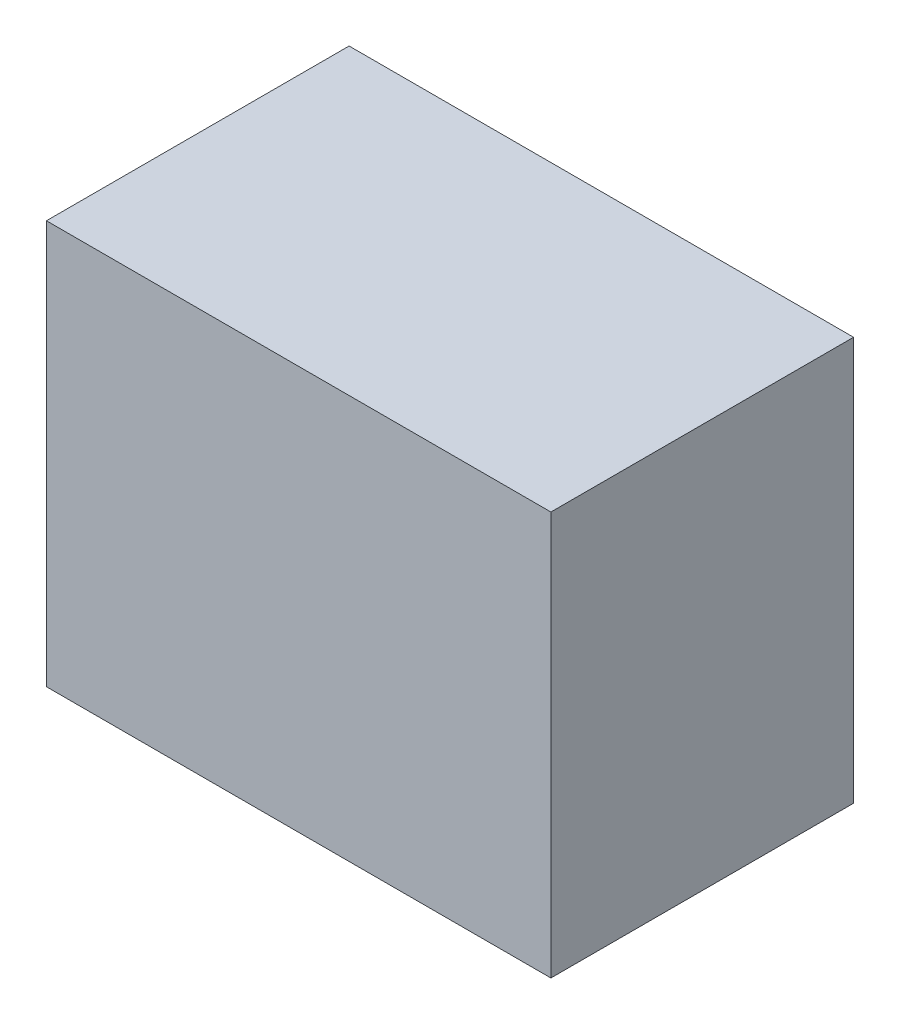
ISO-10303-21;
HEADER;
FILE_DESCRIPTION(('STEP AP214'),'2;1');
FILE_NAME('part.step','',(''),(''),'','','');
FILE_SCHEMA(('AUTOMOTIVE_DESIGN { 1 0 10303 214 1 1 1 1 }'));
ENDSEC;
DATA;
#1=APPLICATION_CONTEXT('core data for automotive mechanical design processes');
#2=APPLICATION_PROTOCOL_DEFINITION('international standard','automotive_design',2000,#1);
#3=PRODUCT_CONTEXT('',#1,'mechanical');
#4=PRODUCT('Part','Part','',(#3));
#5=PRODUCT_RELATED_PRODUCT_CATEGORY('part','',(#4));
#6=PRODUCT_DEFINITION_FORMATION('','',#4);
#7=PRODUCT_DEFINITION_CONTEXT('part definition',#1,'design');
#8=PRODUCT_DEFINITION('design','',#6,#7);
#9=PRODUCT_DEFINITION_SHAPE('','',#8);
#10=(LENGTH_UNIT() NAMED_UNIT(*) SI_UNIT(.MILLI.,.METRE.));
#11=(NAMED_UNIT(*) PLANE_ANGLE_UNIT() SI_UNIT($,.RADIAN.));
#12=(NAMED_UNIT(*) SI_UNIT($,.STERADIAN.) SOLID_ANGLE_UNIT());
#13=UNCERTAINTY_MEASURE_WITH_UNIT(LENGTH_MEASURE(1.E-05),#10,'distance_accuracy_value','');
#14=(GEOMETRIC_REPRESENTATION_CONTEXT(3) GLOBAL_UNCERTAINTY_ASSIGNED_CONTEXT((#13)) GLOBAL_UNIT_ASSIGNED_CONTEXT((#10,
#11,#12)) REPRESENTATION_CONTEXT('',''));
#15=CARTESIAN_POINT('',(0.,0.,0.));
#16=DIRECTION('',(0.,0.,1.));
#17=DIRECTION('',(1.,0.,0.));
#18=AXIS2_PLACEMENT_3D('',#15,#16,#17);
#19=CARTESIAN_POINT('',(-46.900826446281,26.5495867768595,30.));
#20=DIRECTION('',(1.,0.,0.));
#21=DIRECTION('',(0.,1.,0.));
#22=AXIS2_PLACEMENT_3D('',#19,#20,#21);
#23=PLANE('',#22);
#24=DIRECTION('',(0.,-1.,0.));
#25=VECTOR('',#24,1.);
#26=CARTESIAN_POINT('',(-46.900826446281,26.5495867768595,0.));
#27=LINE('',#26,#25);
#28=CARTESIAN_POINT('',(-46.900826446281,26.5495867768595,0.));
#29=VERTEX_POINT('',#28);
#30=CARTESIAN_POINT('',(-46.900826446281,-13.4504132231405,0.));
#31=VERTEX_POINT('',#30);
#32=EDGE_CURVE('E102',#29,#31,#27,.T.);
#33=ORIENTED_EDGE('',*,*,#32,.T.);
#34=DIRECTION('',(0.,0.,-1.));
#35=VECTOR('',#34,1.);
#36=CARTESIAN_POINT('',(-46.900826446281,-13.4504132231405,30.));
#37=LINE('',#36,#35);
#38=CARTESIAN_POINT('',(-46.900826446281,-13.4504132231405,30.));
#39=VERTEX_POINT('',#38);
#40=EDGE_CURVE('E11',#39,#31,#37,.T.);
#41=ORIENTED_EDGE('',*,*,#40,.F.);
#42=DIRECTION('',(0.,-1.,0.));
#43=VECTOR('',#42,1.);
#44=CARTESIAN_POINT('',(-46.900826446281,26.5495867768595,30.));
#45=LINE('',#44,#43);
#46=CARTESIAN_POINT('',(-46.900826446281,26.5495867768595,30.));
#47=VERTEX_POINT('',#46);
#48=EDGE_CURVE('E90',#47,#39,#45,.T.);
#49=ORIENTED_EDGE('',*,*,#48,.F.);
#50=DIRECTION('',(0.,0.,-1.));
#51=VECTOR('',#50,1.);
#52=CARTESIAN_POINT('',(-46.900826446281,26.5495867768595,30.));
#53=LINE('',#52,#51);
#54=EDGE_CURVE('E98',#47,#29,#53,.T.);
#55=ORIENTED_EDGE('',*,*,#54,.T.);
#56=EDGE_LOOP('',(#33,#41,#49,#55));
#57=FACE_BOUND('',#56,.T.);
#58=ADVANCED_FACE('F39',(#57),#23,.F.);
#59=CARTESIAN_POINT('',(-46.900826446281,-13.4504132231405,30.));
#60=DIRECTION('',(0.,1.,0.));
#61=DIRECTION('',(0.,0.,1.));
#62=AXIS2_PLACEMENT_3D('',#59,#60,#61);
#63=PLANE('',#62);
#64=DIRECTION('',(1.,0.,0.));
#65=VECTOR('',#64,1.);
#66=CARTESIAN_POINT('',(-46.900826446281,-13.4504132231405,0.));
#67=LINE('',#66,#65);
#68=CARTESIAN_POINT('',(3.099173553719,-13.4504132231405,0.));
#69=VERTEX_POINT('',#68);
#70=EDGE_CURVE('E94',#31,#69,#67,.T.);
#71=ORIENTED_EDGE('',*,*,#70,.T.);
#72=DIRECTION('',(0.,0.,-1.));
#73=VECTOR('',#72,1.);
#74=CARTESIAN_POINT('',(3.099173553719,-13.4504132231405,30.));
#75=LINE('',#74,#73);
#76=CARTESIAN_POINT('',(3.099173553719,-13.4504132231405,30.));
#77=VERTEX_POINT('',#76);
#78=EDGE_CURVE('E47',#77,#69,#75,.T.);
#79=ORIENTED_EDGE('',*,*,#78,.F.);
#80=DIRECTION('',(1.,0.,0.));
#81=VECTOR('',#80,1.);
#82=CARTESIAN_POINT('',(-46.900826446281,-13.4504132231405,30.));
#83=LINE('',#82,#81);
#84=EDGE_CURVE('E85',#39,#77,#83,.T.);
#85=ORIENTED_EDGE('',*,*,#84,.F.);
#86=ORIENTED_EDGE('',*,*,#40,.T.);
#87=EDGE_LOOP('',(#71,#79,#85,#86));
#88=FACE_BOUND('',#87,.T.);
#89=ADVANCED_FACE('F93',(#88),#63,.F.);
#90=CARTESIAN_POINT('',(3.09917355371899,26.5495867768595,30.));
#91=DIRECTION('',(-1.,0.,0.));
#92=DIRECTION('',(0.,-1.,0.));
#93=AXIS2_PLACEMENT_3D('',#90,#91,#92);
#94=PLANE('',#93);
#95=DIRECTION('',(0.,1.,0.));
#96=VECTOR('',#95,1.);
#97=CARTESIAN_POINT('',(3.09917355371899,26.5495867768595,0.));
#98=LINE('',#97,#96);
#99=CARTESIAN_POINT('',(3.09917355371899,26.5495867768595,0.));
#100=VERTEX_POINT('',#99);
#101=EDGE_CURVE('E72',#69,#100,#98,.T.);
#102=ORIENTED_EDGE('',*,*,#101,.T.);
#103=DIRECTION('',(0.,0.,-1.));
#104=VECTOR('',#103,1.);
#105=CARTESIAN_POINT('',(3.09917355371899,26.5495867768595,30.));
#106=LINE('',#105,#104);
#107=CARTESIAN_POINT('',(3.09917355371899,26.5495867768595,30.));
#108=VERTEX_POINT('',#107);
#109=EDGE_CURVE('E95',#108,#100,#106,.T.);
#110=ORIENTED_EDGE('',*,*,#109,.F.);
#111=DIRECTION('',(0.,1.,0.));
#112=VECTOR('',#111,1.);
#113=CARTESIAN_POINT('',(3.09917355371899,26.5495867768595,30.));
#114=LINE('',#113,#112);
#115=EDGE_CURVE('E88',#77,#108,#114,.T.);
#116=ORIENTED_EDGE('',*,*,#115,.F.);
#117=ORIENTED_EDGE('',*,*,#78,.T.);
#118=EDGE_LOOP('',(#102,#110,#116,#117));
#119=FACE_BOUND('',#118,.T.);
#120=ADVANCED_FACE('F96',(#119),#94,.F.);
#121=CARTESIAN_POINT('',(-46.900826446281,26.5495867768595,30.));
#122=DIRECTION('',(0.,-1.,0.));
#123=DIRECTION('',(0.,0.,-1.));
#124=AXIS2_PLACEMENT_3D('',#121,#122,#123);
#125=PLANE('',#124);
#126=DIRECTION('',(-1.,0.,0.));
#127=VECTOR('',#126,1.);
#128=CARTESIAN_POINT('',(-46.900826446281,26.5495867768595,0.));
#129=LINE('',#128,#127);
#130=EDGE_CURVE('E78',#100,#29,#129,.T.);
#131=ORIENTED_EDGE('',*,*,#130,.T.);
#132=ORIENTED_EDGE('',*,*,#54,.F.);
#133=DIRECTION('',(-1.,0.,0.));
#134=VECTOR('',#133,1.);
#135=CARTESIAN_POINT('',(-46.900826446281,26.5495867768595,30.));
#136=LINE('',#135,#134);
#137=EDGE_CURVE('E55',#108,#47,#136,.T.);
#138=ORIENTED_EDGE('',*,*,#137,.F.);
#139=ORIENTED_EDGE('',*,*,#109,.T.);
#140=EDGE_LOOP('',(#131,#132,#138,#139));
#141=FACE_BOUND('',#140,.T.);
#142=ADVANCED_FACE('F109',(#141),#125,.F.);
#143=CARTESIAN_POINT('',(0.,0.,30.));
#144=DIRECTION('',(0.,0.,1.));
#145=DIRECTION('',(1.,0.,0.));
#146=AXIS2_PLACEMENT_3D('',#143,#144,#145);
#147=PLANE('',#146);
#148=ORIENTED_EDGE('',*,*,#48,.T.);
#149=ORIENTED_EDGE('',*,*,#84,.T.);
#150=ORIENTED_EDGE('',*,*,#115,.T.);
#151=ORIENTED_EDGE('',*,*,#137,.T.);
#152=EDGE_LOOP('',(#148,#149,#150,#151));
#153=FACE_BOUND('',#152,.T.);
#154=ADVANCED_FACE('F86',(#153),#147,.T.);
#155=CARTESIAN_POINT('',(0.,0.,0.));
#156=DIRECTION('',(0.,0.,1.));
#157=DIRECTION('',(1.,0.,0.));
#158=AXIS2_PLACEMENT_3D('',#155,#156,#157);
#159=PLANE('',#158);
#160=ORIENTED_EDGE('',*,*,#32,.F.);
#161=ORIENTED_EDGE('',*,*,#130,.F.);
#162=ORIENTED_EDGE('',*,*,#101,.F.);
#163=ORIENTED_EDGE('',*,*,#70,.F.);
#164=EDGE_LOOP('',(#160,#161,#162,#163));
#165=FACE_BOUND('',#164,.T.);
#166=ADVANCED_FACE('F112',(#165),#159,.F.);
#167=CLOSED_SHELL('',(#58,#89,#120,#142,#154,#166));
#168=MANIFOLD_SOLID_BREP('B2',#167);
#169=ADVANCED_BREP_SHAPE_REPRESENTATION('',(#18,#168),#14);
#170=SHAPE_DEFINITION_REPRESENTATION(#9,#169);
ENDSEC;
END-ISO-10303-21;
